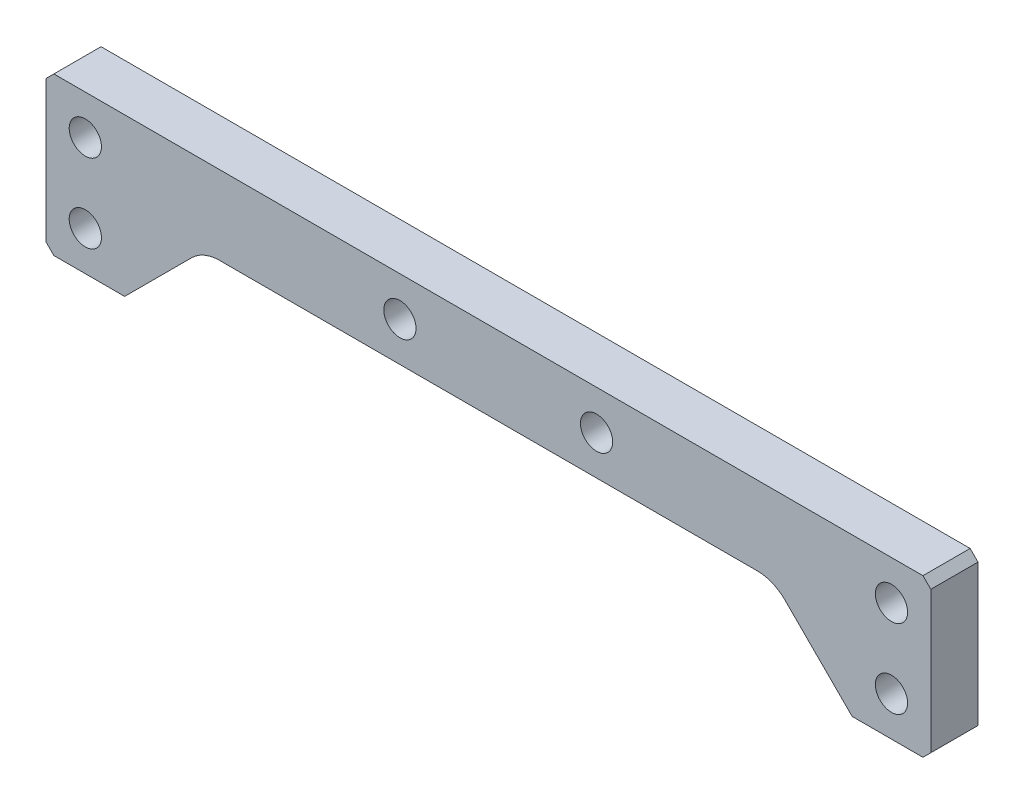
ISO-10303-21;
HEADER;
FILE_DESCRIPTION(('STEP AP214'),'2;1');
FILE_NAME('part.step','',(''),(''),'','','');
FILE_SCHEMA(('AUTOMOTIVE_DESIGN { 1 0 10303 214 1 1 1 1 }'));
ENDSEC;
DATA;
#1=APPLICATION_CONTEXT('core data for automotive mechanical design processes');
#2=APPLICATION_PROTOCOL_DEFINITION('international standard','automotive_design',2000,#1);
#3=PRODUCT_CONTEXT('',#1,'mechanical');
#4=PRODUCT('Part','Part','',(#3));
#5=PRODUCT_RELATED_PRODUCT_CATEGORY('part','',(#4));
#6=PRODUCT_DEFINITION_FORMATION('','',#4);
#7=PRODUCT_DEFINITION_CONTEXT('part definition',#1,'design');
#8=PRODUCT_DEFINITION('design','',#6,#7);
#9=PRODUCT_DEFINITION_SHAPE('','',#8);
#10=(LENGTH_UNIT() NAMED_UNIT(*) SI_UNIT(.MILLI.,.METRE.));
#11=(NAMED_UNIT(*) PLANE_ANGLE_UNIT() SI_UNIT($,.RADIAN.));
#12=(NAMED_UNIT(*) SI_UNIT($,.STERADIAN.) SOLID_ANGLE_UNIT());
#13=UNCERTAINTY_MEASURE_WITH_UNIT(LENGTH_MEASURE(1.E-05),#10,'distance_accuracy_value','');
#14=(GEOMETRIC_REPRESENTATION_CONTEXT(3) GLOBAL_UNCERTAINTY_ASSIGNED_CONTEXT((#13)) GLOBAL_UNIT_ASSIGNED_CONTEXT((#10,
#11,#12)) REPRESENTATION_CONTEXT('',''));
#15=CARTESIAN_POINT('',(0.,0.,0.));
#16=DIRECTION('',(0.,0.,1.));
#17=DIRECTION('',(1.,0.,0.));
#18=AXIS2_PLACEMENT_3D('',#15,#16,#17);
#19=CARTESIAN_POINT('',(0.,0.,12.));
#20=DIRECTION('',(0.,0.,1.));
#21=DIRECTION('',(1.,0.,0.));
#22=AXIS2_PLACEMENT_3D('',#19,#20,#21);
#23=PLANE('',#22);
#24=CARTESIAN_POINT('',(75.,0.,12.));
#25=DIRECTION('',(0.,0.,1.));
#26=DIRECTION('',(1.,0.,0.));
#27=AXIS2_PLACEMENT_3D('',#24,#25,#26);
#28=CIRCLE('',#27,4.1);
#29=CARTESIAN_POINT('',(79.1,0.,12.));
#30=VERTEX_POINT('',#29);
#31=EDGE_CURVE('E291',#30,#30,#28,.T.);
#32=ORIENTED_EDGE('',*,*,#31,.F.);
#33=EDGE_LOOP('',(#32));
#34=FACE_BOUND('',#33,.T.);
#35=CARTESIAN_POINT('',(-130.,0.,12.));
#36=DIRECTION('',(0.,0.,1.));
#37=DIRECTION('',(1.,0.,0.));
#38=AXIS2_PLACEMENT_3D('',#35,#36,#37);
#39=CIRCLE('',#38,4.10000000000001);
#40=CARTESIAN_POINT('',(-125.9,0.,12.));
#41=VERTEX_POINT('',#40);
#42=EDGE_CURVE('E279',#41,#41,#39,.T.);
#43=ORIENTED_EDGE('',*,*,#42,.F.);
#44=EDGE_LOOP('',(#43));
#45=FACE_BOUND('',#44,.T.);
#46=CARTESIAN_POINT('',(0.,0.,12.));
#47=DIRECTION('',(0.,0.,1.));
#48=DIRECTION('',(1.,0.,0.));
#49=AXIS2_PLACEMENT_3D('',#46,#47,#48);
#50=CIRCLE('',#49,4.1);
#51=CARTESIAN_POINT('',(4.1,0.,12.));
#52=VERTEX_POINT('',#51);
#53=EDGE_CURVE('E266',#52,#52,#50,.T.);
#54=ORIENTED_EDGE('',*,*,#53,.F.);
#55=EDGE_LOOP('',(#54));
#56=FACE_BOUND('',#55,.T.);
#57=DIRECTION('',(0.,-1.,0.));
#58=VECTOR('',#57,1.);
#59=CARTESIAN_POINT('',(-140.,9.99999999999998,12.));
#60=LINE('',#59,#58);
#61=CARTESIAN_POINT('',(-140.,8.00000000000001,12.));
#62=VERTEX_POINT('',#61);
#63=CARTESIAN_POINT('',(-140.,-28.,12.));
#64=VERTEX_POINT('',#63);
#65=EDGE_CURVE('E263',#62,#64,#60,.T.);
#66=ORIENTED_EDGE('',*,*,#65,.T.);
#67=DIRECTION('',(-0.707106781186552,0.707106781186543,0.));
#68=VECTOR('',#67,1.);
#69=CARTESIAN_POINT('',(-83.999999999999,-84.0000000000002,12.));
#70=LINE('',#69,#68);
#71=CARTESIAN_POINT('',(-138.,-30.,12.));
#72=VERTEX_POINT('',#71);
#73=EDGE_CURVE('E219',#64,#72,#70,.F.);
#74=ORIENTED_EDGE('',*,*,#73,.T.);
#75=DIRECTION('',(1.,0.,0.));
#76=VECTOR('',#75,1.);
#77=CARTESIAN_POINT('',(-140.,-30.,12.));
#78=LINE('',#77,#76);
#79=CARTESIAN_POINT('',(-120.,-30.,12.));
#80=VERTEX_POINT('',#79);
#81=EDGE_CURVE('E172',#72,#80,#78,.T.);
#82=ORIENTED_EDGE('',*,*,#81,.T.);
#83=DIRECTION('',(-0.707106781186551,-0.707106781186544,0.));
#84=VECTOR('',#83,1.);
#85=CARTESIAN_POINT('',(-99.9999999999998,-9.99999999999999,12.));
#86=LINE('',#85,#84);
#87=CARTESIAN_POINT('',(-102.928932188134,-12.9289321881345,12.));
#88=VERTEX_POINT('',#87);
#89=EDGE_CURVE('E178',#80,#88,#86,.F.);
#90=ORIENTED_EDGE('',*,*,#89,.T.);
#91=CARTESIAN_POINT('',(-95.8578643762689,-20.,12.));
#92=DIRECTION('',(0.,0.,1.));
#93=DIRECTION('',(1.,0.,0.));
#94=AXIS2_PLACEMENT_3D('',#91,#92,#93);
#95=CIRCLE('',#94,10.);
#96=CARTESIAN_POINT('',(-95.8578643762689,-10.,12.));
#97=VERTEX_POINT('',#96);
#98=EDGE_CURVE('E196',#88,#97,#95,.F.);
#99=ORIENTED_EDGE('',*,*,#98,.T.);
#100=DIRECTION('',(1.,0.,0.));
#101=VECTOR('',#100,1.);
#102=CARTESIAN_POINT('',(-120.,-10.,12.));
#103=LINE('',#102,#101);
#104=CARTESIAN_POINT('',(40.8578643762691,-10.,12.));
#105=VERTEX_POINT('',#104);
#106=EDGE_CURVE('E164',#97,#105,#103,.T.);
#107=ORIENTED_EDGE('',*,*,#106,.T.);
#108=CARTESIAN_POINT('',(40.8578643762691,-20.,12.));
#109=DIRECTION('',(0.,0.,1.));
#110=DIRECTION('',(1.,0.,0.));
#111=AXIS2_PLACEMENT_3D('',#108,#109,#110);
#112=CIRCLE('',#111,10.);
#113=CARTESIAN_POINT('',(47.9289321881346,-12.9289321881345,12.));
#114=VERTEX_POINT('',#113);
#115=EDGE_CURVE('E149',#105,#114,#112,.F.);
#116=ORIENTED_EDGE('',*,*,#115,.T.);
#117=DIRECTION('',(-0.707106781186546,0.707106781186549,0.));
#118=VECTOR('',#117,1.);
#119=CARTESIAN_POINT('',(65.,-30.,12.));
#120=LINE('',#119,#118);
#121=CARTESIAN_POINT('',(65.,-30.,12.));
#122=VERTEX_POINT('',#121);
#123=EDGE_CURVE('E142',#114,#122,#120,.F.);
#124=ORIENTED_EDGE('',*,*,#123,.T.);
#125=DIRECTION('',(1.,0.,0.));
#126=VECTOR('',#125,1.);
#127=CARTESIAN_POINT('',(85.,-30.,12.));
#128=LINE('',#127,#126);
#129=CARTESIAN_POINT('',(83.,-30.,12.));
#130=VERTEX_POINT('',#129);
#131=EDGE_CURVE('E146',#122,#130,#128,.T.);
#132=ORIENTED_EDGE('',*,*,#131,.T.);
#133=DIRECTION('',(-0.707106781186552,-0.707106781186543,0.));
#134=VECTOR('',#133,1.);
#135=CARTESIAN_POINT('',(56.4999999999995,-56.5000000000002,12.));
#136=LINE('',#135,#134);
#137=CARTESIAN_POINT('',(85.,-28.,12.));
#138=VERTEX_POINT('',#137);
#139=EDGE_CURVE('E215',#130,#138,#136,.F.);
#140=ORIENTED_EDGE('',*,*,#139,.T.);
#141=DIRECTION('',(0.,1.,0.));
#142=VECTOR('',#141,1.);
#143=CARTESIAN_POINT('',(85.,9.99999999999998,12.));
#144=LINE('',#143,#142);
#145=CARTESIAN_POINT('',(85.,7.99999999999998,12.));
#146=VERTEX_POINT('',#145);
#147=EDGE_CURVE('E163',#138,#146,#144,.T.);
#148=ORIENTED_EDGE('',*,*,#147,.T.);
#149=DIRECTION('',(0.707106781186543,-0.707106781186552,0.));
#150=VECTOR('',#149,1.);
#151=CARTESIAN_POINT('',(46.5000000000006,46.4999999999999,12.));
#152=LINE('',#151,#150);
#153=CARTESIAN_POINT('',(83.,9.99999999999998,12.));
#154=VERTEX_POINT('',#153);
#155=EDGE_CURVE('E63',#146,#154,#152,.F.);
#156=ORIENTED_EDGE('',*,*,#155,.T.);
#157=DIRECTION('',(-1.,0.,0.));
#158=VECTOR('',#157,1.);
#159=CARTESIAN_POINT('',(9.99999999999997,9.99999999999998,12.));
#160=LINE('',#159,#158);
#161=CARTESIAN_POINT('',(-138.,9.99999999999998,12.));
#162=VERTEX_POINT('',#161);
#163=EDGE_CURVE('E261',#154,#162,#160,.T.);
#164=ORIENTED_EDGE('',*,*,#163,.T.);
#165=DIRECTION('',(0.707106781186552,0.707106781186543,0.));
#166=VECTOR('',#165,1.);
#167=CARTESIAN_POINT('',(-73.999999999999,74.0000000000001,12.));
#168=LINE('',#167,#166);
#169=EDGE_CURVE('E217',#162,#62,#168,.F.);
#170=ORIENTED_EDGE('',*,*,#169,.T.);
#171=EDGE_LOOP('',(#66,#74,#82,#90,#99,#107,#116,#124,#132,#140,#148,#156,#164,#170));
#172=FACE_BOUND('',#171,.T.);
#173=CARTESIAN_POINT('',(-50.,0.,12.));
#174=DIRECTION('',(0.,0.,1.));
#175=DIRECTION('',(1.,0.,0.));
#176=AXIS2_PLACEMENT_3D('',#173,#174,#175);
#177=CIRCLE('',#176,4.1);
#178=CARTESIAN_POINT('',(-45.9,0.,12.));
#179=VERTEX_POINT('',#178);
#180=EDGE_CURVE('E274',#179,#179,#177,.T.);
#181=ORIENTED_EDGE('',*,*,#180,.F.);
#182=EDGE_LOOP('',(#181));
#183=FACE_BOUND('',#182,.T.);
#184=CARTESIAN_POINT('',(-130.,-20.,12.));
#185=DIRECTION('',(0.,0.,1.));
#186=DIRECTION('',(1.,0.,0.));
#187=AXIS2_PLACEMENT_3D('',#184,#185,#186);
#188=CIRCLE('',#187,4.09999999999999);
#189=CARTESIAN_POINT('',(-125.9,-20.,12.));
#190=VERTEX_POINT('',#189);
#191=EDGE_CURVE('E285',#190,#190,#188,.T.);
#192=ORIENTED_EDGE('',*,*,#191,.F.);
#193=EDGE_LOOP('',(#192));
#194=FACE_BOUND('',#193,.T.);
#195=CARTESIAN_POINT('',(75.,-20.,12.));
#196=DIRECTION('',(0.,0.,1.));
#197=DIRECTION('',(1.,0.,0.));
#198=AXIS2_PLACEMENT_3D('',#195,#196,#197);
#199=CIRCLE('',#198,4.1);
#200=CARTESIAN_POINT('',(79.1,-20.,12.));
#201=VERTEX_POINT('',#200);
#202=EDGE_CURVE('E297',#201,#201,#199,.T.);
#203=ORIENTED_EDGE('',*,*,#202,.F.);
#204=EDGE_LOOP('',(#203));
#205=FACE_BOUND('',#204,.T.);
#206=ADVANCED_FACE('F40',(#34,#45,#56,#172,#183,#194,#205),#23,.T.);
#207=CARTESIAN_POINT('',(0.,0.,0.));
#208=DIRECTION('',(0.,0.,1.));
#209=DIRECTION('',(1.,0.,0.));
#210=AXIS2_PLACEMENT_3D('',#207,#208,#209);
#211=PLANE('',#210);
#212=DIRECTION('',(1.,0.,0.));
#213=VECTOR('',#212,1.);
#214=CARTESIAN_POINT('',(-140.,-30.,0.));
#215=LINE('',#214,#213);
#216=CARTESIAN_POINT('',(-138.,-30.,0.));
#217=VERTEX_POINT('',#216);
#218=CARTESIAN_POINT('',(-120.,-30.,0.));
#219=VERTEX_POINT('',#218);
#220=EDGE_CURVE('E251',#217,#219,#215,.T.);
#221=ORIENTED_EDGE('',*,*,#220,.F.);
#222=DIRECTION('',(0.707106781186552,-0.707106781186543,0.));
#223=VECTOR('',#222,1.);
#224=CARTESIAN_POINT('',(-138.,-30.,0.));
#225=LINE('',#224,#223);
#226=CARTESIAN_POINT('',(-140.,-28.,0.));
#227=VERTEX_POINT('',#226);
#228=EDGE_CURVE('E207',#217,#227,#225,.F.);
#229=ORIENTED_EDGE('',*,*,#228,.T.);
#230=DIRECTION('',(0.,-1.,0.));
#231=VECTOR('',#230,1.);
#232=CARTESIAN_POINT('',(-140.,-10.,0.));
#233=LINE('',#232,#231);
#234=CARTESIAN_POINT('',(-140.,8.00000000000001,0.));
#235=VERTEX_POINT('',#234);
#236=EDGE_CURVE('E244',#235,#227,#233,.T.);
#237=ORIENTED_EDGE('',*,*,#236,.F.);
#238=DIRECTION('',(-0.707106781186552,-0.707106781186543,0.));
#239=VECTOR('',#238,1.);
#240=CARTESIAN_POINT('',(-140.,8.00000000000001,0.));
#241=LINE('',#240,#239);
#242=CARTESIAN_POINT('',(-138.,9.99999999999998,0.));
#243=VERTEX_POINT('',#242);
#244=EDGE_CURVE('E205',#235,#243,#241,.F.);
#245=ORIENTED_EDGE('',*,*,#244,.T.);
#246=DIRECTION('',(-1.,0.,0.));
#247=VECTOR('',#246,1.);
#248=CARTESIAN_POINT('',(-140.,9.99999999999998,0.));
#249=LINE('',#248,#247);
#250=CARTESIAN_POINT('',(83.,9.99999999999998,0.));
#251=VERTEX_POINT('',#250);
#252=EDGE_CURVE('E241',#251,#243,#249,.T.);
#253=ORIENTED_EDGE('',*,*,#252,.F.);
#254=DIRECTION('',(-0.707106781186543,0.707106781186552,0.));
#255=VECTOR('',#254,1.);
#256=CARTESIAN_POINT('',(83.,9.99999999999998,0.));
#257=LINE('',#256,#255);
#258=CARTESIAN_POINT('',(85.,7.99999999999998,0.));
#259=VERTEX_POINT('',#258);
#260=EDGE_CURVE('E201',#251,#259,#257,.F.);
#261=ORIENTED_EDGE('',*,*,#260,.T.);
#262=DIRECTION('',(0.,1.,0.));
#263=VECTOR('',#262,1.);
#264=CARTESIAN_POINT('',(85.,9.99999999999998,0.));
#265=LINE('',#264,#263);
#266=CARTESIAN_POINT('',(85.,-28.,0.));
#267=VERTEX_POINT('',#266);
#268=EDGE_CURVE('E233',#267,#259,#265,.T.);
#269=ORIENTED_EDGE('',*,*,#268,.F.);
#270=DIRECTION('',(0.707106781186552,0.707106781186543,0.));
#271=VECTOR('',#270,1.);
#272=CARTESIAN_POINT('',(85.,-28.,0.));
#273=LINE('',#272,#271);
#274=CARTESIAN_POINT('',(83.,-30.,0.));
#275=VERTEX_POINT('',#274);
#276=EDGE_CURVE('E203',#267,#275,#273,.F.);
#277=ORIENTED_EDGE('',*,*,#276,.T.);
#278=DIRECTION('',(1.,0.,0.));
#279=VECTOR('',#278,1.);
#280=CARTESIAN_POINT('',(85.,-30.,0.));
#281=LINE('',#280,#279);
#282=CARTESIAN_POINT('',(65.,-30.,0.));
#283=VERTEX_POINT('',#282);
#284=EDGE_CURVE('E242',#283,#275,#281,.T.);
#285=ORIENTED_EDGE('',*,*,#284,.F.);
#286=DIRECTION('',(0.707106781186546,-0.707106781186549,0.));
#287=VECTOR('',#286,1.);
#288=CARTESIAN_POINT('',(17.5000000000001,17.5000000000001,0.));
#289=LINE('',#288,#287);
#290=CARTESIAN_POINT('',(47.9289321881346,-12.9289321881345,0.));
#291=VERTEX_POINT('',#290);
#292=EDGE_CURVE('E154',#283,#291,#289,.F.);
#293=ORIENTED_EDGE('',*,*,#292,.T.);
#294=CARTESIAN_POINT('',(40.8578643762691,-20.,0.));
#295=DIRECTION('',(0.,0.,1.));
#296=DIRECTION('',(1.,0.,0.));
#297=AXIS2_PLACEMENT_3D('',#294,#295,#296);
#298=CIRCLE('',#297,10.);
#299=CARTESIAN_POINT('',(40.8578643762691,-10.,0.));
#300=VERTEX_POINT('',#299);
#301=EDGE_CURVE('E192',#291,#300,#298,.T.);
#302=ORIENTED_EDGE('',*,*,#301,.T.);
#303=DIRECTION('',(1.,0.,0.));
#304=VECTOR('',#303,1.);
#305=CARTESIAN_POINT('',(65.,-10.,0.));
#306=LINE('',#305,#304);
#307=CARTESIAN_POINT('',(-95.8578643762689,-9.99999999999999,0.));
#308=VERTEX_POINT('',#307);
#309=EDGE_CURVE('E246',#308,#300,#306,.T.);
#310=ORIENTED_EDGE('',*,*,#309,.F.);
#311=CARTESIAN_POINT('',(-95.8578643762689,-20.,0.));
#312=DIRECTION('',(0.,0.,1.));
#313=DIRECTION('',(1.,0.,0.));
#314=AXIS2_PLACEMENT_3D('',#311,#312,#313);
#315=CIRCLE('',#314,10.);
#316=CARTESIAN_POINT('',(-102.928932188134,-12.9289321881345,0.));
#317=VERTEX_POINT('',#316);
#318=EDGE_CURVE('E194',#308,#317,#315,.T.);
#319=ORIENTED_EDGE('',*,*,#318,.T.);
#320=DIRECTION('',(0.707106781186551,0.707106781186544,0.));
#321=VECTOR('',#320,1.);
#322=CARTESIAN_POINT('',(-44.9999999999994,44.9999999999999,0.));
#323=LINE('',#322,#321);
#324=EDGE_CURVE('E153',#317,#219,#323,.F.);
#325=ORIENTED_EDGE('',*,*,#324,.T.);
#326=EDGE_LOOP('',(#221,#229,#237,#245,#253,#261,#269,#277,#285,#293,#302,#310,#319,#325));
#327=FACE_BOUND('',#326,.T.);
#328=CARTESIAN_POINT('',(0.,0.,0.));
#329=DIRECTION('',(0.,0.,1.));
#330=DIRECTION('',(1.,0.,0.));
#331=AXIS2_PLACEMENT_3D('',#328,#329,#330);
#332=CIRCLE('',#331,4.1);
#333=CARTESIAN_POINT('',(4.1,0.,0.));
#334=VERTEX_POINT('',#333);
#335=EDGE_CURVE('E257',#334,#334,#332,.T.);
#336=ORIENTED_EDGE('',*,*,#335,.T.);
#337=EDGE_LOOP('',(#336));
#338=FACE_BOUND('',#337,.T.);
#339=CARTESIAN_POINT('',(-50.,0.,0.));
#340=DIRECTION('',(0.,0.,1.));
#341=DIRECTION('',(1.,0.,0.));
#342=AXIS2_PLACEMENT_3D('',#339,#340,#341);
#343=CIRCLE('',#342,4.1);
#344=CARTESIAN_POINT('',(-45.9,0.,0.));
#345=VERTEX_POINT('',#344);
#346=EDGE_CURVE('E276',#345,#345,#343,.T.);
#347=ORIENTED_EDGE('',*,*,#346,.T.);
#348=EDGE_LOOP('',(#347));
#349=FACE_BOUND('',#348,.T.);
#350=CARTESIAN_POINT('',(-130.,0.,0.));
#351=DIRECTION('',(0.,0.,1.));
#352=DIRECTION('',(1.,0.,0.));
#353=AXIS2_PLACEMENT_3D('',#350,#351,#352);
#354=CIRCLE('',#353,4.10000000000001);
#355=CARTESIAN_POINT('',(-125.9,0.,0.));
#356=VERTEX_POINT('',#355);
#357=EDGE_CURVE('E282',#356,#356,#354,.T.);
#358=ORIENTED_EDGE('',*,*,#357,.T.);
#359=EDGE_LOOP('',(#358));
#360=FACE_BOUND('',#359,.T.);
#361=CARTESIAN_POINT('',(-130.,-20.,0.));
#362=DIRECTION('',(0.,0.,1.));
#363=DIRECTION('',(1.,0.,0.));
#364=AXIS2_PLACEMENT_3D('',#361,#362,#363);
#365=CIRCLE('',#364,4.09999999999999);
#366=CARTESIAN_POINT('',(-125.9,-20.,0.));
#367=VERTEX_POINT('',#366);
#368=EDGE_CURVE('E288',#367,#367,#365,.T.);
#369=ORIENTED_EDGE('',*,*,#368,.T.);
#370=EDGE_LOOP('',(#369));
#371=FACE_BOUND('',#370,.T.);
#372=CARTESIAN_POINT('',(75.,0.,0.));
#373=DIRECTION('',(0.,0.,1.));
#374=DIRECTION('',(1.,0.,0.));
#375=AXIS2_PLACEMENT_3D('',#372,#373,#374);
#376=CIRCLE('',#375,4.1);
#377=CARTESIAN_POINT('',(79.1,0.,0.));
#378=VERTEX_POINT('',#377);
#379=EDGE_CURVE('E294',#378,#378,#376,.T.);
#380=ORIENTED_EDGE('',*,*,#379,.T.);
#381=EDGE_LOOP('',(#380));
#382=FACE_BOUND('',#381,.T.);
#383=CARTESIAN_POINT('',(75.,-20.,0.));
#384=DIRECTION('',(0.,0.,1.));
#385=DIRECTION('',(1.,0.,0.));
#386=AXIS2_PLACEMENT_3D('',#383,#384,#385);
#387=CIRCLE('',#386,4.1);
#388=CARTESIAN_POINT('',(79.1,-20.,0.));
#389=VERTEX_POINT('',#388);
#390=EDGE_CURVE('E300',#389,#389,#387,.T.);
#391=ORIENTED_EDGE('',*,*,#390,.T.);
#392=EDGE_LOOP('',(#391));
#393=FACE_BOUND('',#392,.T.);
#394=ADVANCED_FACE('F238',(#327,#338,#349,#360,#371,#382,#393),#211,.F.);
#395=CARTESIAN_POINT('',(65.,-10.,12.));
#396=DIRECTION('',(0.,1.,0.));
#397=DIRECTION('',(-1.,0.,0.));
#398=AXIS2_PLACEMENT_3D('',#395,#396,#397);
#399=PLANE('',#398);
#400=ORIENTED_EDGE('',*,*,#309,.T.);
#401=DIRECTION('',(0.,0.,-1.));
#402=VECTOR('',#401,1.);
#403=CARTESIAN_POINT('',(40.8578643762691,-10.,12.));
#404=LINE('',#403,#402);
#405=EDGE_CURVE('E184',#300,#105,#404,.F.);
#406=ORIENTED_EDGE('',*,*,#405,.T.);
#407=ORIENTED_EDGE('',*,*,#106,.F.);
#408=DIRECTION('',(0.,0.,1.));
#409=VECTOR('',#408,1.);
#410=CARTESIAN_POINT('',(-95.8578643762689,-9.99999999999999,0.));
#411=LINE('',#410,#409);
#412=EDGE_CURVE('E181',#97,#308,#411,.F.);
#413=ORIENTED_EDGE('',*,*,#412,.T.);
#414=EDGE_LOOP('',(#400,#406,#407,#413));
#415=FACE_BOUND('',#414,.T.);
#416=ADVANCED_FACE('F315',(#415),#399,.F.);
#417=CARTESIAN_POINT('',(85.,-30.,12.));
#418=DIRECTION('',(0.,1.,0.));
#419=DIRECTION('',(0.,0.,1.));
#420=AXIS2_PLACEMENT_3D('',#417,#418,#419);
#421=PLANE('',#420);
#422=ORIENTED_EDGE('',*,*,#284,.T.);
#423=DIRECTION('',(0.,0.,1.));
#424=VECTOR('',#423,1.);
#425=CARTESIAN_POINT('',(83.,-30.,12.));
#426=LINE('',#425,#424);
#427=EDGE_CURVE('E11',#275,#130,#426,.T.);
#428=ORIENTED_EDGE('',*,*,#427,.T.);
#429=ORIENTED_EDGE('',*,*,#131,.F.);
#430=DIRECTION('',(0.,0.,-1.));
#431=VECTOR('',#430,1.);
#432=CARTESIAN_POINT('',(65.,-30.,12.));
#433=LINE('',#432,#431);
#434=EDGE_CURVE('E160',#122,#283,#433,.T.);
#435=ORIENTED_EDGE('',*,*,#434,.T.);
#436=EDGE_LOOP('',(#422,#428,#429,#435));
#437=FACE_BOUND('',#436,.T.);
#438=ADVANCED_FACE('F159',(#437),#421,.F.);
#439=CARTESIAN_POINT('',(85.,9.99999999999998,12.));
#440=DIRECTION('',(-1.,0.,0.));
#441=DIRECTION('',(0.,0.,1.));
#442=AXIS2_PLACEMENT_3D('',#439,#440,#441);
#443=PLANE('',#442);
#444=ORIENTED_EDGE('',*,*,#147,.F.);
#445=DIRECTION('',(0.,0.,-1.));
#446=VECTOR('',#445,1.);
#447=CARTESIAN_POINT('',(85.,-28.,12.));
#448=LINE('',#447,#446);
#449=EDGE_CURVE('E49',#138,#267,#448,.T.);
#450=ORIENTED_EDGE('',*,*,#449,.T.);
#451=ORIENTED_EDGE('',*,*,#268,.T.);
#452=DIRECTION('',(0.,0.,1.));
#453=VECTOR('',#452,1.);
#454=CARTESIAN_POINT('',(85.,7.99999999999998,12.));
#455=LINE('',#454,#453);
#456=EDGE_CURVE('E225',#259,#146,#455,.T.);
#457=ORIENTED_EDGE('',*,*,#456,.T.);
#458=EDGE_LOOP('',(#444,#450,#451,#457));
#459=FACE_BOUND('',#458,.T.);
#460=ADVANCED_FACE('F232',(#459),#443,.F.);
#461=CARTESIAN_POINT('',(-140.,9.99999999999998,12.));
#462=DIRECTION('',(0.,-1.,0.));
#463=DIRECTION('',(0.,0.,-1.));
#464=AXIS2_PLACEMENT_3D('',#461,#462,#463);
#465=PLANE('',#464);
#466=ORIENTED_EDGE('',*,*,#252,.T.);
#467=DIRECTION('',(0.,0.,1.));
#468=VECTOR('',#467,1.);
#469=CARTESIAN_POINT('',(-138.,9.99999999999998,12.));
#470=LINE('',#469,#468);
#471=EDGE_CURVE('E56',#243,#162,#470,.T.);
#472=ORIENTED_EDGE('',*,*,#471,.T.);
#473=ORIENTED_EDGE('',*,*,#163,.F.);
#474=DIRECTION('',(0.,0.,-1.));
#475=VECTOR('',#474,1.);
#476=CARTESIAN_POINT('',(83.,9.99999999999998,12.));
#477=LINE('',#476,#475);
#478=EDGE_CURVE('E221',#154,#251,#477,.T.);
#479=ORIENTED_EDGE('',*,*,#478,.T.);
#480=EDGE_LOOP('',(#466,#472,#473,#479));
#481=FACE_BOUND('',#480,.T.);
#482=ADVANCED_FACE('F329',(#481),#465,.F.);
#483=CARTESIAN_POINT('',(-140.,-10.,12.));
#484=DIRECTION('',(1.,0.,0.));
#485=DIRECTION('',(0.,0.,-1.));
#486=AXIS2_PLACEMENT_3D('',#483,#484,#485);
#487=PLANE('',#486);
#488=ORIENTED_EDGE('',*,*,#236,.T.);
#489=DIRECTION('',(0.,0.,1.));
#490=VECTOR('',#489,1.);
#491=CARTESIAN_POINT('',(-140.,-28.,12.));
#492=LINE('',#491,#490);
#493=EDGE_CURVE('E212',#227,#64,#492,.T.);
#494=ORIENTED_EDGE('',*,*,#493,.T.);
#495=ORIENTED_EDGE('',*,*,#65,.F.);
#496=DIRECTION('',(0.,0.,-1.));
#497=VECTOR('',#496,1.);
#498=CARTESIAN_POINT('',(-140.,8.00000000000001,12.));
#499=LINE('',#498,#497);
#500=EDGE_CURVE('E209',#62,#235,#499,.T.);
#501=ORIENTED_EDGE('',*,*,#500,.T.);
#502=EDGE_LOOP('',(#488,#494,#495,#501));
#503=FACE_BOUND('',#502,.T.);
#504=ADVANCED_FACE('F326',(#503),#487,.F.);
#505=CARTESIAN_POINT('',(-140.,-30.,12.));
#506=DIRECTION('',(0.,1.,0.));
#507=DIRECTION('',(0.,0.,1.));
#508=AXIS2_PLACEMENT_3D('',#505,#506,#507);
#509=PLANE('',#508);
#510=ORIENTED_EDGE('',*,*,#81,.F.);
#511=DIRECTION('',(0.,0.,-1.));
#512=VECTOR('',#511,1.);
#513=CARTESIAN_POINT('',(-138.,-30.,12.));
#514=LINE('',#513,#512);
#515=EDGE_CURVE('E198',#72,#217,#514,.T.);
#516=ORIENTED_EDGE('',*,*,#515,.T.);
#517=ORIENTED_EDGE('',*,*,#220,.T.);
#518=DIRECTION('',(0.,0.,-1.));
#519=VECTOR('',#518,1.);
#520=CARTESIAN_POINT('',(-120.,-30.,12.));
#521=LINE('',#520,#519);
#522=EDGE_CURVE('E168',#80,#219,#521,.T.);
#523=ORIENTED_EDGE('',*,*,#522,.F.);
#524=EDGE_LOOP('',(#510,#516,#517,#523));
#525=FACE_BOUND('',#524,.T.);
#526=ADVANCED_FACE('F323',(#525),#509,.F.);
#527=CARTESIAN_POINT('',(0.,0.,12.));
#528=DIRECTION('',(0.,0.,-1.));
#529=DIRECTION('',(-1.,0.,0.));
#530=AXIS2_PLACEMENT_3D('',#527,#528,#529);
#531=CYLINDRICAL_SURFACE('',#530,4.1);
#532=ORIENTED_EDGE('',*,*,#53,.T.);
#533=EDGE_LOOP('',(#532));
#534=FACE_BOUND('',#533,.T.);
#535=ORIENTED_EDGE('',*,*,#335,.F.);
#536=EDGE_LOOP('',(#535));
#537=FACE_BOUND('',#536,.T.);
#538=ADVANCED_FACE('F320',(#534,#537),#531,.F.);
#539=CARTESIAN_POINT('',(-50.,0.,12.));
#540=DIRECTION('',(0.,0.,-1.));
#541=DIRECTION('',(-1.,0.,0.));
#542=AXIS2_PLACEMENT_3D('',#539,#540,#541);
#543=CYLINDRICAL_SURFACE('',#542,4.1);
#544=ORIENTED_EDGE('',*,*,#180,.T.);
#545=EDGE_LOOP('',(#544));
#546=FACE_BOUND('',#545,.T.);
#547=ORIENTED_EDGE('',*,*,#346,.F.);
#548=EDGE_LOOP('',(#547));
#549=FACE_BOUND('',#548,.T.);
#550=ADVANCED_FACE('F528',(#546,#549),#543,.F.);
#551=CARTESIAN_POINT('',(-130.,0.,12.));
#552=DIRECTION('',(0.,0.,-1.));
#553=DIRECTION('',(-1.,0.,0.));
#554=AXIS2_PLACEMENT_3D('',#551,#552,#553);
#555=CYLINDRICAL_SURFACE('',#554,4.10000000000001);
#556=ORIENTED_EDGE('',*,*,#42,.T.);
#557=EDGE_LOOP('',(#556));
#558=FACE_BOUND('',#557,.T.);
#559=ORIENTED_EDGE('',*,*,#357,.F.);
#560=EDGE_LOOP('',(#559));
#561=FACE_BOUND('',#560,.T.);
#562=ADVANCED_FACE('F518',(#558,#561),#555,.F.);
#563=CARTESIAN_POINT('',(-130.,-20.,12.));
#564=DIRECTION('',(0.,0.,-1.));
#565=DIRECTION('',(-1.,0.,0.));
#566=AXIS2_PLACEMENT_3D('',#563,#564,#565);
#567=CYLINDRICAL_SURFACE('',#566,4.09999999999999);
#568=ORIENTED_EDGE('',*,*,#191,.T.);
#569=EDGE_LOOP('',(#568));
#570=FACE_BOUND('',#569,.T.);
#571=ORIENTED_EDGE('',*,*,#368,.F.);
#572=EDGE_LOOP('',(#571));
#573=FACE_BOUND('',#572,.T.);
#574=ADVANCED_FACE('F508',(#570,#573),#567,.F.);
#575=CARTESIAN_POINT('',(75.,0.,12.));
#576=DIRECTION('',(0.,0.,-1.));
#577=DIRECTION('',(-1.,0.,0.));
#578=AXIS2_PLACEMENT_3D('',#575,#576,#577);
#579=CYLINDRICAL_SURFACE('',#578,4.1);
#580=ORIENTED_EDGE('',*,*,#31,.T.);
#581=EDGE_LOOP('',(#580));
#582=FACE_BOUND('',#581,.T.);
#583=ORIENTED_EDGE('',*,*,#379,.F.);
#584=EDGE_LOOP('',(#583));
#585=FACE_BOUND('',#584,.T.);
#586=ADVANCED_FACE('F499',(#582,#585),#579,.F.);
#587=CARTESIAN_POINT('',(75.,-20.,12.));
#588=DIRECTION('',(0.,0.,-1.));
#589=DIRECTION('',(-1.,0.,0.));
#590=AXIS2_PLACEMENT_3D('',#587,#588,#589);
#591=CYLINDRICAL_SURFACE('',#590,4.1);
#592=ORIENTED_EDGE('',*,*,#202,.T.);
#593=EDGE_LOOP('',(#592));
#594=FACE_BOUND('',#593,.T.);
#595=ORIENTED_EDGE('',*,*,#390,.F.);
#596=EDGE_LOOP('',(#595));
#597=FACE_BOUND('',#596,.T.);
#598=ADVANCED_FACE('F306',(#594,#597),#591,.F.);
#599=CARTESIAN_POINT('',(65.,-30.,12.));
#600=DIRECTION('',(-0.707106781186549,-0.707106781186546,0.));
#601=DIRECTION('',(0.,0.,1.));
#602=AXIS2_PLACEMENT_3D('',#599,#600,#601);
#603=PLANE('',#602);
#604=ORIENTED_EDGE('',*,*,#123,.F.);
#605=DIRECTION('',(0.,0.,1.));
#606=VECTOR('',#605,1.);
#607=CARTESIAN_POINT('',(47.9289321881346,-12.9289321881345,0.));
#608=LINE('',#607,#606);
#609=EDGE_CURVE('E187',#114,#291,#608,.F.);
#610=ORIENTED_EDGE('',*,*,#609,.T.);
#611=ORIENTED_EDGE('',*,*,#292,.F.);
#612=ORIENTED_EDGE('',*,*,#434,.F.);
#613=EDGE_LOOP('',(#604,#610,#611,#612));
#614=FACE_BOUND('',#613,.T.);
#615=ADVANCED_FACE('F166',(#614),#603,.T.);
#616=CARTESIAN_POINT('',(-99.9999999999998,-9.99999999999999,12.));
#617=DIRECTION('',(0.707106781186544,-0.707106781186551,0.));
#618=DIRECTION('',(0.,0.,1.));
#619=AXIS2_PLACEMENT_3D('',#616,#617,#618);
#620=PLANE('',#619);
#621=ORIENTED_EDGE('',*,*,#324,.F.);
#622=DIRECTION('',(0.,0.,-1.));
#623=VECTOR('',#622,1.);
#624=CARTESIAN_POINT('',(-102.928932188134,-12.9289321881345,12.));
#625=LINE('',#624,#623);
#626=EDGE_CURVE('E189',#317,#88,#625,.F.);
#627=ORIENTED_EDGE('',*,*,#626,.T.);
#628=ORIENTED_EDGE('',*,*,#89,.F.);
#629=ORIENTED_EDGE('',*,*,#522,.T.);
#630=EDGE_LOOP('',(#621,#627,#628,#629));
#631=FACE_BOUND('',#630,.T.);
#632=ADVANCED_FACE('F345',(#631),#620,.T.);
#633=CARTESIAN_POINT('',(40.8578643762691,-20.,12.));
#634=DIRECTION('',(0.,0.,1.));
#635=DIRECTION('',(1.,0.,0.));
#636=AXIS2_PLACEMENT_3D('',#633,#634,#635);
#637=CYLINDRICAL_SURFACE('',#636,10.);
#638=ORIENTED_EDGE('',*,*,#301,.F.);
#639=ORIENTED_EDGE('',*,*,#609,.F.);
#640=ORIENTED_EDGE('',*,*,#115,.F.);
#641=ORIENTED_EDGE('',*,*,#405,.F.);
#642=EDGE_LOOP('',(#638,#639,#640,#641));
#643=FACE_BOUND('',#642,.T.);
#644=ADVANCED_FACE('F351',(#643),#637,.F.);
#645=CARTESIAN_POINT('',(-95.8578643762689,-20.,12.));
#646=DIRECTION('',(0.,0.,-1.));
#647=DIRECTION('',(-1.,0.,0.));
#648=AXIS2_PLACEMENT_3D('',#645,#646,#647);
#649=CYLINDRICAL_SURFACE('',#648,10.);
#650=ORIENTED_EDGE('',*,*,#98,.F.);
#651=ORIENTED_EDGE('',*,*,#626,.F.);
#652=ORIENTED_EDGE('',*,*,#318,.F.);
#653=ORIENTED_EDGE('',*,*,#412,.F.);
#654=EDGE_LOOP('',(#650,#651,#652,#653));
#655=FACE_BOUND('',#654,.T.);
#656=ADVANCED_FACE('F355',(#655),#649,.F.);
#657=CARTESIAN_POINT('',(-138.,-30.,12.));
#658=DIRECTION('',(0.707106781186542,0.707106781186552,0.));
#659=DIRECTION('',(0.,0.,-1.));
#660=AXIS2_PLACEMENT_3D('',#657,#658,#659);
#661=PLANE('',#660);
#662=ORIENTED_EDGE('',*,*,#73,.F.);
#663=ORIENTED_EDGE('',*,*,#493,.F.);
#664=ORIENTED_EDGE('',*,*,#228,.F.);
#665=ORIENTED_EDGE('',*,*,#515,.F.);
#666=EDGE_LOOP('',(#662,#663,#664,#665));
#667=FACE_BOUND('',#666,.T.);
#668=ADVANCED_FACE('F359',(#667),#661,.F.);
#669=CARTESIAN_POINT('',(-140.,8.00000000000001,12.));
#670=DIRECTION('',(0.707106781186543,-0.707106781186552,0.));
#671=DIRECTION('',(0.,0.,-1.));
#672=AXIS2_PLACEMENT_3D('',#669,#670,#671);
#673=PLANE('',#672);
#674=ORIENTED_EDGE('',*,*,#169,.F.);
#675=ORIENTED_EDGE('',*,*,#471,.F.);
#676=ORIENTED_EDGE('',*,*,#244,.F.);
#677=ORIENTED_EDGE('',*,*,#500,.F.);
#678=EDGE_LOOP('',(#674,#675,#676,#677));
#679=FACE_BOUND('',#678,.T.);
#680=ADVANCED_FACE('F366',(#679),#673,.F.);
#681=CARTESIAN_POINT('',(85.,-28.,12.));
#682=DIRECTION('',(-0.707106781186543,0.707106781186552,0.));
#683=DIRECTION('',(0.,0.,-1.));
#684=AXIS2_PLACEMENT_3D('',#681,#682,#683);
#685=PLANE('',#684);
#686=ORIENTED_EDGE('',*,*,#139,.F.);
#687=ORIENTED_EDGE('',*,*,#427,.F.);
#688=ORIENTED_EDGE('',*,*,#276,.F.);
#689=ORIENTED_EDGE('',*,*,#449,.F.);
#690=EDGE_LOOP('',(#686,#687,#688,#689));
#691=FACE_BOUND('',#690,.T.);
#692=ADVANCED_FACE('F372',(#691),#685,.F.);
#693=CARTESIAN_POINT('',(83.,9.99999999999998,12.));
#694=DIRECTION('',(-0.707106781186552,-0.707106781186543,0.));
#695=DIRECTION('',(0.,0.,-1.));
#696=AXIS2_PLACEMENT_3D('',#693,#694,#695);
#697=PLANE('',#696);
#698=ORIENTED_EDGE('',*,*,#155,.F.);
#699=ORIENTED_EDGE('',*,*,#456,.F.);
#700=ORIENTED_EDGE('',*,*,#260,.F.);
#701=ORIENTED_EDGE('',*,*,#478,.F.);
#702=EDGE_LOOP('',(#698,#699,#700,#701));
#703=FACE_BOUND('',#702,.T.);
#704=ADVANCED_FACE('F43',(#703),#697,.F.);
#705=CLOSED_SHELL('',(#206,#394,#416,#438,#460,#482,#504,#526,#538,#550,#562,#574,#586,#598,
#615,#632,#644,#656,#668,#680,#692,#704));
#706=MANIFOLD_SOLID_BREP('B2',#705);
#707=ADVANCED_BREP_SHAPE_REPRESENTATION('',(#18,#706),#14);
#708=SHAPE_DEFINITION_REPRESENTATION(#9,#707);
ENDSEC;
END-ISO-10303-21;
